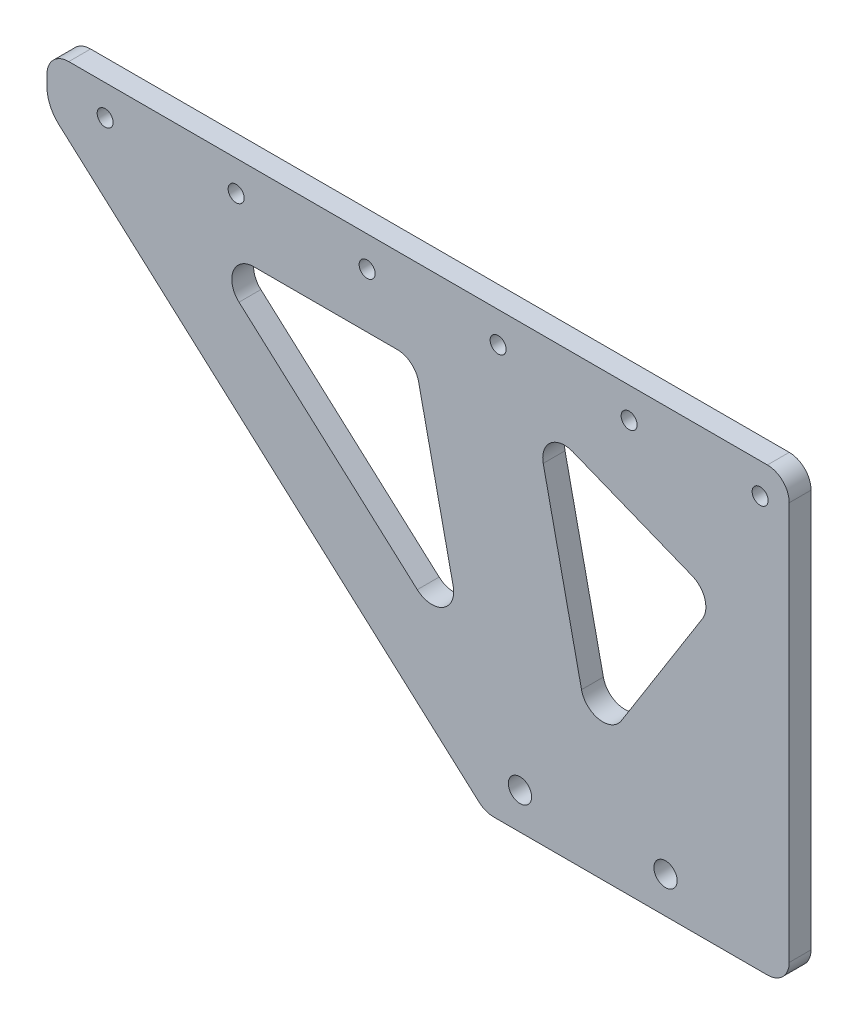
ISO-10303-21;
HEADER;
FILE_DESCRIPTION(('STEP AP214'),'2;1');
FILE_NAME('part.step','',(''),(''),'','','');
FILE_SCHEMA(('AUTOMOTIVE_DESIGN { 1 0 10303 214 1 1 1 1 }'));
ENDSEC;
DATA;
#1=APPLICATION_CONTEXT('core data for automotive mechanical design processes');
#2=APPLICATION_PROTOCOL_DEFINITION('international standard','automotive_design',2000,#1);
#3=PRODUCT_CONTEXT('',#1,'mechanical');
#4=PRODUCT('Part','Part','',(#3));
#5=PRODUCT_RELATED_PRODUCT_CATEGORY('part','',(#4));
#6=PRODUCT_DEFINITION_FORMATION('','',#4);
#7=PRODUCT_DEFINITION_CONTEXT('part definition',#1,'design');
#8=PRODUCT_DEFINITION('design','',#6,#7);
#9=PRODUCT_DEFINITION_SHAPE('','',#8);
#10=(LENGTH_UNIT() NAMED_UNIT(*) SI_UNIT(.MILLI.,.METRE.));
#11=(NAMED_UNIT(*) PLANE_ANGLE_UNIT() SI_UNIT($,.RADIAN.));
#12=(NAMED_UNIT(*) SI_UNIT($,.STERADIAN.) SOLID_ANGLE_UNIT());
#13=UNCERTAINTY_MEASURE_WITH_UNIT(LENGTH_MEASURE(1.E-05),#10,'distance_accuracy_value','');
#14=(GEOMETRIC_REPRESENTATION_CONTEXT(3) GLOBAL_UNCERTAINTY_ASSIGNED_CONTEXT((#13)) GLOBAL_UNIT_ASSIGNED_CONTEXT((#10,
#11,#12)) REPRESENTATION_CONTEXT('',''));
#15=CARTESIAN_POINT('',(0.,0.,0.));
#16=DIRECTION('',(0.,0.,1.));
#17=DIRECTION('',(1.,0.,0.));
#18=AXIS2_PLACEMENT_3D('',#15,#16,#17);
#19=CARTESIAN_POINT('',(-100.,-5.,3.));
#20=DIRECTION('',(1.,0.,0.));
#21=DIRECTION('',(0.,0.,-1.));
#22=AXIS2_PLACEMENT_3D('',#19,#20,#21);
#23=PLANE('',#22);
#24=DIRECTION('',(0.,-1.,0.));
#25=VECTOR('',#24,1.);
#26=CARTESIAN_POINT('',(-100.,-5.,3.));
#27=LINE('',#26,#25);
#28=CARTESIAN_POINT('',(-100.,-1.3,3.));
#29=VERTEX_POINT('',#28);
#30=CARTESIAN_POINT('',(-100.,-2.7674682433964,3.));
#31=VERTEX_POINT('',#30);
#32=EDGE_CURVE('E214',#29,#31,#27,.T.);
#33=ORIENTED_EDGE('',*,*,#32,.F.);
#34=DIRECTION('',(0.,0.,1.));
#35=VECTOR('',#34,1.);
#36=CARTESIAN_POINT('',(-100.,-1.3,0.));
#37=LINE('',#36,#35);
#38=CARTESIAN_POINT('',(-100.,-1.3,0.));
#39=VERTEX_POINT('',#38);
#40=EDGE_CURVE('E311',#29,#39,#37,.F.);
#41=ORIENTED_EDGE('',*,*,#40,.T.);
#42=DIRECTION('',(0.,-1.,0.));
#43=VECTOR('',#42,1.);
#44=CARTESIAN_POINT('',(-100.,-5.,0.));
#45=LINE('',#44,#43);
#46=CARTESIAN_POINT('',(-100.,-2.7674682433964,0.));
#47=VERTEX_POINT('',#46);
#48=EDGE_CURVE('E215',#39,#47,#45,.T.);
#49=ORIENTED_EDGE('',*,*,#48,.T.);
#50=DIRECTION('',(0.,0.,-1.));
#51=VECTOR('',#50,1.);
#52=CARTESIAN_POINT('',(-100.,-2.7674682433964,3.));
#53=LINE('',#52,#51);
#54=EDGE_CURVE('E198',#47,#31,#53,.F.);
#55=ORIENTED_EDGE('',*,*,#54,.T.);
#56=EDGE_LOOP('',(#33,#41,#49,#55));
#57=FACE_BOUND('',#56,.T.);
#58=ADVANCED_FACE('F41',(#57),#23,.F.);
#59=CARTESIAN_POINT('',(-42.,-57.,3.));
#60=DIRECTION('',(0.667545015752026,0.74456944064649,0.));
#61=DIRECTION('',(-0.74456944064649,0.667545015752026,0.));
#62=AXIS2_PLACEMENT_3D('',#59,#60,#61);
#63=PLANE('',#62);
#64=DIRECTION('',(0.74456944064649,-0.667545015752026,0.));
#65=VECTOR('',#64,1.);
#66=CARTESIAN_POINT('',(-42.,-57.,0.));
#67=LINE('',#66,#65);
#68=CARTESIAN_POINT('',(-98.3377250787601,-6.49031544662886,0.));
#69=VERTEX_POINT('',#68);
#70=CARTESIAN_POINT('',(-40.6239407178367,-58.2337083219395,0.));
#71=VERTEX_POINT('',#70);
#72=EDGE_CURVE('E206',#69,#71,#67,.T.);
#73=ORIENTED_EDGE('',*,*,#72,.T.);
#74=DIRECTION('',(0.,0.,1.));
#75=VECTOR('',#74,1.);
#76=CARTESIAN_POINT('',(-40.6239407178367,-58.2337083219395,3.));
#77=LINE('',#76,#75);
#78=CARTESIAN_POINT('',(-40.6239407178367,-58.2337083219395,3.));
#79=VERTEX_POINT('',#78);
#80=EDGE_CURVE('E11',#71,#79,#77,.T.);
#81=ORIENTED_EDGE('',*,*,#80,.T.);
#82=DIRECTION('',(0.74456944064649,-0.667545015752026,0.));
#83=VECTOR('',#82,1.);
#84=CARTESIAN_POINT('',(-42.,-57.,3.));
#85=LINE('',#84,#83);
#86=CARTESIAN_POINT('',(-98.3377250787601,-6.49031544662886,3.));
#87=VERTEX_POINT('',#86);
#88=EDGE_CURVE('E209',#87,#79,#85,.T.);
#89=ORIENTED_EDGE('',*,*,#88,.F.);
#90=DIRECTION('',(0.,0.,-1.));
#91=VECTOR('',#90,1.);
#92=CARTESIAN_POINT('',(-98.3377250787601,-6.49031544662884,3.));
#93=LINE('',#92,#91);
#94=EDGE_CURVE('E196',#87,#69,#93,.T.);
#95=ORIENTED_EDGE('',*,*,#94,.T.);
#96=EDGE_LOOP('',(#73,#81,#89,#95));
#97=FACE_BOUND('',#96,.T.);
#98=ADVANCED_FACE('F205',(#97),#63,.F.);
#99=CARTESIAN_POINT('',(0.,0.,3.));
#100=DIRECTION('',(0.,0.,-1.));
#101=DIRECTION('',(-1.,0.,0.));
#102=AXIS2_PLACEMENT_3D('',#99,#100,#101);
#103=PLANE('',#102);
#104=DIRECTION('',(0.74456944064649,-0.667545015752026,0.));
#105=VECTOR('',#104,1.);
#106=CARTESIAN_POINT('',(-79.4428137737304,-10.,3.));
#107=LINE('',#106,#105);
#108=CARTESIAN_POINT('',(-73.6052160300287,-15.2337083219395,3.));
#109=VERTEX_POINT('',#108);
#110=CARTESIAN_POINT('',(-49.1089723530373,-37.195857825449,3.));
#111=VERTEX_POINT('',#110);
#112=EDGE_CURVE('E359',#109,#111,#107,.T.);
#113=ORIENTED_EDGE('',*,*,#112,.F.);
#114=CARTESIAN_POINT('',(-71.6025809827726,-13.,3.));
#115=DIRECTION('',(0.,0.,-1.));
#116=DIRECTION('',(-1.,0.,0.));
#117=AXIS2_PLACEMENT_3D('',#114,#115,#116);
#118=CIRCLE('',#117,3.);
#119=CARTESIAN_POINT('',(-71.6025809827726,-10.,3.));
#120=VERTEX_POINT('',#119);
#121=EDGE_CURVE('E289',#109,#120,#118,.T.);
#122=ORIENTED_EDGE('',*,*,#121,.T.);
#123=DIRECTION('',(-1.,0.,0.));
#124=VECTOR('',#123,1.);
#125=CARTESIAN_POINT('',(-79.4428137737304,-10.,3.));
#126=LINE('',#125,#124);
#127=CARTESIAN_POINT('',(-51.8626542495009,-10.,3.));
#128=VERTEX_POINT('',#127);
#129=EDGE_CURVE('E356',#128,#120,#126,.T.);
#130=ORIENTED_EDGE('',*,*,#129,.F.);
#131=CARTESIAN_POINT('',(-51.8626542495009,-13.,3.));
#132=DIRECTION('',(0.,0.,-1.));
#133=DIRECTION('',(-1.,0.,0.));
#134=AXIS2_PLACEMENT_3D('',#131,#132,#133);
#135=CIRCLE('',#134,3.);
#136=CARTESIAN_POINT('',(-48.9306254739786,-12.3650139690442,3.));
#137=VERTEX_POINT('',#136);
#138=EDGE_CURVE('E281',#128,#137,#135,.T.);
#139=ORIENTED_EDGE('',*,*,#138,.T.);
#140=DIRECTION('',(-0.211662010318587,0.977342925174114,0.));
#141=VECTOR('',#140,1.);
#142=CARTESIAN_POINT('',(-49.4428137737304,-10.,3.));
#143=LINE('',#142,#141);
#144=CARTESIAN_POINT('',(-44.1743085302589,-34.3271634725538,3.));
#145=VERTEX_POINT('',#144);
#146=EDGE_CURVE('E363',#145,#137,#143,.T.);
#147=ORIENTED_EDGE('',*,*,#146,.F.);
#148=CARTESIAN_POINT('',(-47.1063373057812,-34.9621495035095,3.));
#149=DIRECTION('',(0.,0.,-1.));
#150=DIRECTION('',(-1.,0.,0.));
#151=AXIS2_PLACEMENT_3D('',#148,#149,#150);
#152=CIRCLE('',#151,3.);
#153=EDGE_CURVE('E285',#145,#111,#152,.T.);
#154=ORIENTED_EDGE('',*,*,#153,.T.);
#155=EDGE_LOOP('',(#113,#122,#130,#139,#147,#154));
#156=FACE_BOUND('',#155,.T.);
#157=DIRECTION('',(0.532520352814284,0.846417198453901,0.));
#158=VECTOR('',#157,1.);
#159=CARTESIAN_POINT('',(-7.99999999999999,-18.,3.));
#160=LINE('',#159,#158);
#161=CARTESIAN_POINT('',(-21.0718268380449,-38.7770820259917,3.));
#162=VERTEX_POINT('',#161);
#163=CARTESIAN_POINT('',(-9.91658473540623,-21.0463254104164,3.));
#164=VERTEX_POINT('',#163);
#165=EDGE_CURVE('E369',#162,#164,#160,.T.);
#166=ORIENTED_EDGE('',*,*,#165,.F.);
#167=CARTESIAN_POINT('',(-23.6110784334066,-37.1795209675489,3.));
#168=DIRECTION('',(0.,0.,-1.));
#169=DIRECTION('',(-1.,0.,0.));
#170=AXIS2_PLACEMENT_3D('',#167,#168,#169);
#171=CIRCLE('',#170,3.);
#172=CARTESIAN_POINT('',(-26.5431072089289,-37.8145069985046,3.));
#173=VERTEX_POINT('',#172);
#174=EDGE_CURVE('E277',#162,#173,#171,.T.);
#175=ORIENTED_EDGE('',*,*,#174,.T.);
#176=DIRECTION('',(0.211662010318587,-0.977342925174114,0.));
#177=VECTOR('',#176,1.);
#178=CARTESIAN_POINT('',(-24.9869534223184,-45.,3.));
#179=LINE('',#178,#177);
#180=CARTESIAN_POINT('',(-31.8052323429341,-13.5168034882718,3.));
#181=VERTEX_POINT('',#180);
#182=EDGE_CURVE('E360',#181,#173,#179,.T.);
#183=ORIENTED_EDGE('',*,*,#182,.F.);
#184=CARTESIAN_POINT('',(-28.8732035674118,-12.881817457316,3.));
#185=DIRECTION('',(0.,0.,-1.));
#186=DIRECTION('',(-1.,0.,0.));
#187=AXIS2_PLACEMENT_3D('',#184,#185,#186);
#188=CIRCLE('',#187,3.);
#189=CARTESIAN_POINT('',(-27.7590315383495,-10.0963873846602,3.));
#190=VERTEX_POINT('',#189);
#191=EDGE_CURVE('E293',#181,#190,#188,.T.);
#192=ORIENTED_EDGE('',*,*,#191,.T.);
#193=DIRECTION('',(-0.928476690885259,0.371390676354103,0.));
#194=VECTOR('',#193,1.);
#195=CARTESIAN_POINT('',(-33.,-8.,3.));
#196=LINE('',#195,#194);
#197=CARTESIAN_POINT('',(-11.3416643017056,-16.6633342793177,3.));
#198=VERTEX_POINT('',#197);
#199=EDGE_CURVE('E355',#198,#190,#196,.T.);
#200=ORIENTED_EDGE('',*,*,#199,.F.);
#201=CARTESIAN_POINT('',(-12.4558363307679,-19.4487643519735,3.));
#202=DIRECTION('',(0.,0.,-1.));
#203=DIRECTION('',(-1.,0.,0.));
#204=AXIS2_PLACEMENT_3D('',#201,#202,#203);
#205=CIRCLE('',#204,3.);
#206=EDGE_CURVE('E273',#198,#164,#205,.T.);
#207=ORIENTED_EDGE('',*,*,#206,.T.);
#208=EDGE_LOOP('',(#166,#175,#183,#192,#200,#207));
#209=FACE_BOUND('',#208,.T.);
#210=CARTESIAN_POINT('',(-15.,-54.,3.));
#211=DIRECTION('',(0.,0.,1.));
#212=DIRECTION('',(1.,0.,0.));
#213=AXIS2_PLACEMENT_3D('',#210,#211,#212);
#214=CIRCLE('',#213,1.6);
#215=CARTESIAN_POINT('',(-13.4,-54.,3.));
#216=VERTEX_POINT('',#215);
#217=EDGE_CURVE('E377',#216,#216,#214,.T.);
#218=ORIENTED_EDGE('',*,*,#217,.F.);
#219=EDGE_LOOP('',(#218));
#220=FACE_BOUND('',#219,.T.);
#221=CARTESIAN_POINT('',(-74.0000000000001,-2.50000000000026,3.));
#222=DIRECTION('',(0.,0.,1.));
#223=DIRECTION('',(-1.,0.,0.));
#224=AXIS2_PLACEMENT_3D('',#221,#222,#223);
#225=CIRCLE('',#224,1.09999999999999);
#226=CARTESIAN_POINT('',(-75.1000000000001,-2.50000000000026,3.));
#227=VERTEX_POINT('',#226);
#228=EDGE_CURVE('E408',#227,#227,#225,.T.);
#229=ORIENTED_EDGE('',*,*,#228,.F.);
#230=EDGE_LOOP('',(#229));
#231=FACE_BOUND('',#230,.T.);
#232=CARTESIAN_POINT('',(-20.,-2.5,3.));
#233=DIRECTION('',(0.,0.,1.));
#234=DIRECTION('',(1.,0.,0.));
#235=AXIS2_PLACEMENT_3D('',#232,#233,#234);
#236=CIRCLE('',#235,1.1);
#237=CARTESIAN_POINT('',(-18.9,-2.5,3.));
#238=VERTEX_POINT('',#237);
#239=EDGE_CURVE('E401',#238,#238,#236,.T.);
#240=ORIENTED_EDGE('',*,*,#239,.F.);
#241=EDGE_LOOP('',(#240));
#242=FACE_BOUND('',#241,.T.);
#243=CARTESIAN_POINT('',(-1.99999999999989,-2.5,3.));
#244=DIRECTION('',(0.,0.,1.));
#245=DIRECTION('',(1.,0.,0.));
#246=AXIS2_PLACEMENT_3D('',#243,#244,#245);
#247=CIRCLE('',#246,1.1);
#248=CARTESIAN_POINT('',(-0.899999999999891,-2.5,3.));
#249=VERTEX_POINT('',#248);
#250=EDGE_CURVE('E395',#249,#249,#247,.T.);
#251=ORIENTED_EDGE('',*,*,#250,.F.);
#252=EDGE_LOOP('',(#251));
#253=FACE_BOUND('',#252,.T.);
#254=CARTESIAN_POINT('',(-92.0000000000001,-2.50000000000038,3.));
#255=DIRECTION('',(0.,0.,1.));
#256=DIRECTION('',(-1.,0.,0.));
#257=AXIS2_PLACEMENT_3D('',#254,#255,#256);
#258=CIRCLE('',#257,1.10000000000001);
#259=CARTESIAN_POINT('',(-93.1000000000001,-2.50000000000038,3.));
#260=VERTEX_POINT('',#259);
#261=EDGE_CURVE('E366',#260,#260,#258,.T.);
#262=ORIENTED_EDGE('',*,*,#261,.F.);
#263=EDGE_LOOP('',(#262));
#264=FACE_BOUND('',#263,.T.);
#265=CARTESIAN_POINT('',(-35.,-54.,3.));
#266=DIRECTION('',(0.,0.,1.));
#267=DIRECTION('',(1.,0.,0.));
#268=AXIS2_PLACEMENT_3D('',#265,#266,#267);
#269=CIRCLE('',#268,1.6);
#270=CARTESIAN_POINT('',(-33.4,-54.,3.));
#271=VERTEX_POINT('',#270);
#272=EDGE_CURVE('E384',#271,#271,#269,.T.);
#273=ORIENTED_EDGE('',*,*,#272,.F.);
#274=EDGE_LOOP('',(#273));
#275=FACE_BOUND('',#274,.T.);
#276=CARTESIAN_POINT('',(-38.0000000000001,-2.50000000000001,3.));
#277=DIRECTION('',(0.,0.,1.));
#278=DIRECTION('',(-1.,0.,0.));
#279=AXIS2_PLACEMENT_3D('',#276,#277,#278);
#280=CIRCLE('',#279,1.10000000000001);
#281=CARTESIAN_POINT('',(-39.1000000000001,-2.50000000000001,3.));
#282=VERTEX_POINT('',#281);
#283=EDGE_CURVE('E378',#282,#282,#280,.T.);
#284=ORIENTED_EDGE('',*,*,#283,.F.);
#285=EDGE_LOOP('',(#284));
#286=FACE_BOUND('',#285,.T.);
#287=CARTESIAN_POINT('',(-56.0000000000001,-2.50000000000013,3.));
#288=DIRECTION('',(0.,0.,1.));
#289=DIRECTION('',(-1.,0.,0.));
#290=AXIS2_PLACEMENT_3D('',#287,#288,#289);
#291=CIRCLE('',#290,1.10000000000001);
#292=CARTESIAN_POINT('',(-57.1000000000001,-2.50000000000013,3.));
#293=VERTEX_POINT('',#292);
#294=EDGE_CURVE('E407',#293,#293,#291,.T.);
#295=ORIENTED_EDGE('',*,*,#294,.F.);
#296=EDGE_LOOP('',(#295));
#297=FACE_BOUND('',#296,.T.);
#298=DIRECTION('',(1.,0.,0.));
#299=VECTOR('',#298,1.);
#300=CARTESIAN_POINT('',(-100.,1.7,3.));
#301=LINE('',#300,#299);
#302=CARTESIAN_POINT('',(-97.,1.7,3.));
#303=VERTEX_POINT('',#302);
#304=CARTESIAN_POINT('',(-1.,1.7,3.));
#305=VERTEX_POINT('',#304);
#306=EDGE_CURVE('E346',#303,#305,#301,.T.);
#307=ORIENTED_EDGE('',*,*,#306,.F.);
#308=CARTESIAN_POINT('',(-97.,-1.3,3.));
#309=DIRECTION('',(0.,0.,-1.));
#310=DIRECTION('',(-1.,0.,0.));
#311=AXIS2_PLACEMENT_3D('',#308,#309,#310);
#312=CIRCLE('',#311,3.);
#313=EDGE_CURVE('E309',#303,#29,#312,.F.);
#314=ORIENTED_EDGE('',*,*,#313,.T.);
#315=ORIENTED_EDGE('',*,*,#32,.T.);
#316=CARTESIAN_POINT('',(-95.,-2.7674682433964,3.));
#317=DIRECTION('',(0.,0.,-1.));
#318=DIRECTION('',(-1.,0.,0.));
#319=AXIS2_PLACEMENT_3D('',#316,#317,#318);
#320=CIRCLE('',#319,5.);
#321=EDGE_CURVE('E223',#31,#87,#320,.F.);
#322=ORIENTED_EDGE('',*,*,#321,.T.);
#323=ORIENTED_EDGE('',*,*,#88,.T.);
#324=CARTESIAN_POINT('',(-38.6213056705807,-56.,3.));
#325=DIRECTION('',(0.,0.,-1.));
#326=DIRECTION('',(-1.,0.,0.));
#327=AXIS2_PLACEMENT_3D('',#324,#325,#326);
#328=CIRCLE('',#327,3.);
#329=CARTESIAN_POINT('',(-38.6213056705807,-59.,3.));
#330=VERTEX_POINT('',#329);
#331=EDGE_CURVE('E305',#79,#330,#328,.F.);
#332=ORIENTED_EDGE('',*,*,#331,.T.);
#333=DIRECTION('',(1.,0.,0.));
#334=VECTOR('',#333,1.);
#335=CARTESIAN_POINT('',(0.,-59.,3.));
#336=LINE('',#335,#334);
#337=CARTESIAN_POINT('',(-0.999999999999992,-59.,3.));
#338=VERTEX_POINT('',#337);
#339=EDGE_CURVE('E327',#330,#338,#336,.T.);
#340=ORIENTED_EDGE('',*,*,#339,.T.);
#341=CARTESIAN_POINT('',(-0.999999999999993,-56.,3.));
#342=DIRECTION('',(0.,0.,-1.));
#343=DIRECTION('',(-1.,0.,0.));
#344=AXIS2_PLACEMENT_3D('',#341,#342,#343);
#345=CIRCLE('',#344,3.);
#346=CARTESIAN_POINT('',(2.00000000000001,-56.,3.));
#347=VERTEX_POINT('',#346);
#348=EDGE_CURVE('E307',#338,#347,#345,.F.);
#349=ORIENTED_EDGE('',*,*,#348,.T.);
#350=DIRECTION('',(0.,-1.,0.));
#351=VECTOR('',#350,1.);
#352=CARTESIAN_POINT('',(2.,0.,3.));
#353=LINE('',#352,#351);
#354=CARTESIAN_POINT('',(2.,-1.3,3.));
#355=VERTEX_POINT('',#354);
#356=EDGE_CURVE('E336',#355,#347,#353,.T.);
#357=ORIENTED_EDGE('',*,*,#356,.F.);
#358=CARTESIAN_POINT('',(-1.,-1.3,3.));
#359=DIRECTION('',(0.,0.,-1.));
#360=DIRECTION('',(-1.,0.,0.));
#361=AXIS2_PLACEMENT_3D('',#358,#359,#360);
#362=CIRCLE('',#361,3.);
#363=EDGE_CURVE('E303',#355,#305,#362,.F.);
#364=ORIENTED_EDGE('',*,*,#363,.T.);
#365=EDGE_LOOP('',(#307,#314,#315,#322,#323,#332,#340,#349,#357,#364));
#366=FACE_BOUND('',#365,.T.);
#367=ADVANCED_FACE('F333',(#156,#209,#220,#231,#242,#253,#264,#275,#286,#297,#366),#103,.F.);
#368=CARTESIAN_POINT('',(0.,0.,0.));
#369=DIRECTION('',(0.,0.,-1.));
#370=DIRECTION('',(-1.,0.,0.));
#371=AXIS2_PLACEMENT_3D('',#368,#369,#370);
#372=PLANE('',#371);
#373=DIRECTION('',(1.,0.,0.));
#374=VECTOR('',#373,1.);
#375=CARTESIAN_POINT('',(0.,-9.99999999999999,0.));
#376=LINE('',#375,#374);
#377=CARTESIAN_POINT('',(-71.6025809827726,-10.,0.));
#378=VERTEX_POINT('',#377);
#379=CARTESIAN_POINT('',(-51.8626542495009,-10.,0.));
#380=VERTEX_POINT('',#379);
#381=EDGE_CURVE('E240',#378,#380,#376,.T.);
#382=ORIENTED_EDGE('',*,*,#381,.F.);
#383=CARTESIAN_POINT('',(-71.6025809827726,-13.,0.));
#384=DIRECTION('',(0.,0.,-1.));
#385=DIRECTION('',(-1.,0.,0.));
#386=AXIS2_PLACEMENT_3D('',#383,#384,#385);
#387=CIRCLE('',#386,3.);
#388=CARTESIAN_POINT('',(-73.6052160300287,-15.2337083219395,0.));
#389=VERTEX_POINT('',#388);
#390=EDGE_CURVE('E291',#378,#389,#387,.F.);
#391=ORIENTED_EDGE('',*,*,#390,.T.);
#392=DIRECTION('',(-0.74456944064649,0.667545015752026,0.));
#393=VECTOR('',#392,1.);
#394=CARTESIAN_POINT('',(-40.3713527429412,-45.0295857517421,0.));
#395=LINE('',#394,#393);
#396=CARTESIAN_POINT('',(-49.1089723530373,-37.195857825449,0.));
#397=VERTEX_POINT('',#396);
#398=EDGE_CURVE('E234',#397,#389,#395,.T.);
#399=ORIENTED_EDGE('',*,*,#398,.F.);
#400=CARTESIAN_POINT('',(-47.1063373057812,-34.9621495035095,0.));
#401=DIRECTION('',(0.,0.,-1.));
#402=DIRECTION('',(-1.,0.,0.));
#403=AXIS2_PLACEMENT_3D('',#400,#401,#402);
#404=CIRCLE('',#403,3.);
#405=CARTESIAN_POINT('',(-44.1743085302589,-34.3271634725538,0.));
#406=VERTEX_POINT('',#405);
#407=EDGE_CURVE('E287',#397,#406,#404,.F.);
#408=ORIENTED_EDGE('',*,*,#407,.T.);
#409=DIRECTION('',(0.211662010318587,-0.977342925174114,0.));
#410=VECTOR('',#409,1.);
#411=CARTESIAN_POINT('',(-49.2963995186252,-10.6760633906687,0.));
#412=LINE('',#411,#410);
#413=CARTESIAN_POINT('',(-48.9306254739786,-12.3650139690442,0.));
#414=VERTEX_POINT('',#413);
#415=EDGE_CURVE('E237',#414,#406,#412,.T.);
#416=ORIENTED_EDGE('',*,*,#415,.F.);
#417=CARTESIAN_POINT('',(-51.8626542495009,-13.,0.));
#418=DIRECTION('',(0.,0.,-1.));
#419=DIRECTION('',(-1.,0.,0.));
#420=AXIS2_PLACEMENT_3D('',#417,#418,#419);
#421=CIRCLE('',#420,3.);
#422=EDGE_CURVE('E283',#414,#380,#421,.F.);
#423=ORIENTED_EDGE('',*,*,#422,.T.);
#424=EDGE_LOOP('',(#382,#391,#399,#408,#416,#423));
#425=FACE_BOUND('',#424,.T.);
#426=DIRECTION('',(-0.211662010318587,0.977342925174114,0.));
#427=VECTOR('',#426,1.);
#428=CARTESIAN_POINT('',(-33.1765043283045,-7.18499660722589,0.));
#429=LINE('',#428,#427);
#430=CARTESIAN_POINT('',(-26.5431072089289,-37.8145069985046,0.));
#431=VERTEX_POINT('',#430);
#432=CARTESIAN_POINT('',(-31.8052323429341,-13.5168034882718,0.));
#433=VERTEX_POINT('',#432);
#434=EDGE_CURVE('E231',#431,#433,#429,.T.);
#435=ORIENTED_EDGE('',*,*,#434,.F.);
#436=CARTESIAN_POINT('',(-23.6110784334066,-37.1795209675489,0.));
#437=DIRECTION('',(0.,0.,-1.));
#438=DIRECTION('',(-1.,0.,0.));
#439=AXIS2_PLACEMENT_3D('',#436,#437,#438);
#440=CIRCLE('',#439,3.);
#441=CARTESIAN_POINT('',(-21.0718268380449,-38.7770820259917,0.));
#442=VERTEX_POINT('',#441);
#443=EDGE_CURVE('E279',#431,#442,#440,.F.);
#444=ORIENTED_EDGE('',*,*,#443,.T.);
#445=DIRECTION('',(-0.532520352814284,-0.846417198453901,0.));
#446=VECTOR('',#445,1.);
#447=CARTESIAN_POINT('',(2.38184234196909,-1.49852758971611,0.));
#448=LINE('',#447,#446);
#449=CARTESIAN_POINT('',(-9.91658473540623,-21.0463254104164,0.));
#450=VERTEX_POINT('',#449);
#451=EDGE_CURVE('E225',#450,#442,#448,.T.);
#452=ORIENTED_EDGE('',*,*,#451,.F.);
#453=CARTESIAN_POINT('',(-12.4558363307679,-19.4487643519735,0.));
#454=DIRECTION('',(0.,0.,-1.));
#455=DIRECTION('',(-1.,0.,0.));
#456=AXIS2_PLACEMENT_3D('',#453,#454,#455);
#457=CIRCLE('',#456,3.);
#458=CARTESIAN_POINT('',(-11.3416643017056,-16.6633342793177,0.));
#459=VERTEX_POINT('',#458);
#460=EDGE_CURVE('E275',#450,#459,#457,.F.);
#461=ORIENTED_EDGE('',*,*,#460,.T.);
#462=DIRECTION('',(0.928476690885259,-0.371390676354103,0.));
#463=VECTOR('',#462,1.);
#464=CARTESIAN_POINT('',(-7.3103448275862,-18.2758620689655,0.));
#465=LINE('',#464,#463);
#466=CARTESIAN_POINT('',(-27.7590315383495,-10.0963873846602,0.));
#467=VERTEX_POINT('',#466);
#468=EDGE_CURVE('E228',#467,#459,#465,.T.);
#469=ORIENTED_EDGE('',*,*,#468,.F.);
#470=CARTESIAN_POINT('',(-28.8732035674118,-12.881817457316,0.));
#471=DIRECTION('',(0.,0.,-1.));
#472=DIRECTION('',(-1.,0.,0.));
#473=AXIS2_PLACEMENT_3D('',#470,#471,#472);
#474=CIRCLE('',#473,3.);
#475=EDGE_CURVE('E295',#467,#433,#474,.F.);
#476=ORIENTED_EDGE('',*,*,#475,.T.);
#477=EDGE_LOOP('',(#435,#444,#452,#461,#469,#476));
#478=FACE_BOUND('',#477,.T.);
#479=CARTESIAN_POINT('',(-15.,-54.,0.));
#480=DIRECTION('',(0.,0.,1.));
#481=DIRECTION('',(1.,0.,0.));
#482=AXIS2_PLACEMENT_3D('',#479,#480,#481);
#483=CIRCLE('',#482,1.6);
#484=CARTESIAN_POINT('',(-13.4,-54.,0.));
#485=VERTEX_POINT('',#484);
#486=EDGE_CURVE('E392',#485,#485,#483,.T.);
#487=ORIENTED_EDGE('',*,*,#486,.T.);
#488=EDGE_LOOP('',(#487));
#489=FACE_BOUND('',#488,.T.);
#490=CARTESIAN_POINT('',(-74.0000000000001,-2.50000000000026,0.));
#491=DIRECTION('',(0.,0.,1.));
#492=DIRECTION('',(-1.,0.,0.));
#493=AXIS2_PLACEMENT_3D('',#490,#491,#492);
#494=CIRCLE('',#493,1.09999999999999);
#495=CARTESIAN_POINT('',(-75.1000000000001,-2.50000000000026,0.));
#496=VERTEX_POINT('',#495);
#497=EDGE_CURVE('E404',#496,#496,#494,.T.);
#498=ORIENTED_EDGE('',*,*,#497,.T.);
#499=EDGE_LOOP('',(#498));
#500=FACE_BOUND('',#499,.T.);
#501=CARTESIAN_POINT('',(-20.,-2.5,0.));
#502=DIRECTION('',(0.,0.,1.));
#503=DIRECTION('',(1.,0.,0.));
#504=AXIS2_PLACEMENT_3D('',#501,#502,#503);
#505=CIRCLE('',#504,1.1);
#506=CARTESIAN_POINT('',(-18.9,-2.5,0.));
#507=VERTEX_POINT('',#506);
#508=EDGE_CURVE('E411',#507,#507,#505,.T.);
#509=ORIENTED_EDGE('',*,*,#508,.T.);
#510=EDGE_LOOP('',(#509));
#511=FACE_BOUND('',#510,.T.);
#512=CARTESIAN_POINT('',(-1.99999999999989,-2.5,0.));
#513=DIRECTION('',(0.,0.,1.));
#514=DIRECTION('',(1.,0.,0.));
#515=AXIS2_PLACEMENT_3D('',#512,#513,#514);
#516=CIRCLE('',#515,1.1);
#517=CARTESIAN_POINT('',(-0.899999999999891,-2.5,0.));
#518=VERTEX_POINT('',#517);
#519=EDGE_CURVE('E398',#518,#518,#516,.T.);
#520=ORIENTED_EDGE('',*,*,#519,.T.);
#521=EDGE_LOOP('',(#520));
#522=FACE_BOUND('',#521,.T.);
#523=CARTESIAN_POINT('',(-92.0000000000001,-2.50000000000038,0.));
#524=DIRECTION('',(0.,0.,1.));
#525=DIRECTION('',(-1.,0.,0.));
#526=AXIS2_PLACEMENT_3D('',#523,#524,#525);
#527=CIRCLE('',#526,1.10000000000001);
#528=CARTESIAN_POINT('',(-93.1000000000001,-2.50000000000038,0.));
#529=VERTEX_POINT('',#528);
#530=EDGE_CURVE('E387',#529,#529,#527,.T.);
#531=ORIENTED_EDGE('',*,*,#530,.T.);
#532=EDGE_LOOP('',(#531));
#533=FACE_BOUND('',#532,.T.);
#534=CARTESIAN_POINT('',(-35.,-54.,0.));
#535=DIRECTION('',(0.,0.,1.));
#536=DIRECTION('',(1.,0.,0.));
#537=AXIS2_PLACEMENT_3D('',#534,#535,#536);
#538=CIRCLE('',#537,1.6);
#539=CARTESIAN_POINT('',(-33.4,-54.,0.));
#540=VERTEX_POINT('',#539);
#541=EDGE_CURVE('E381',#540,#540,#538,.T.);
#542=ORIENTED_EDGE('',*,*,#541,.T.);
#543=EDGE_LOOP('',(#542));
#544=FACE_BOUND('',#543,.T.);
#545=CARTESIAN_POINT('',(-38.0000000000001,-2.50000000000001,0.));
#546=DIRECTION('',(0.,0.,1.));
#547=DIRECTION('',(-1.,0.,0.));
#548=AXIS2_PLACEMENT_3D('',#545,#546,#547);
#549=CIRCLE('',#548,1.10000000000001);
#550=CARTESIAN_POINT('',(-39.1000000000001,-2.50000000000001,0.));
#551=VERTEX_POINT('',#550);
#552=EDGE_CURVE('E374',#551,#551,#549,.T.);
#553=ORIENTED_EDGE('',*,*,#552,.T.);
#554=EDGE_LOOP('',(#553));
#555=FACE_BOUND('',#554,.T.);
#556=CARTESIAN_POINT('',(-56.0000000000001,-2.50000000000013,0.));
#557=DIRECTION('',(0.,0.,1.));
#558=DIRECTION('',(-1.,0.,0.));
#559=AXIS2_PLACEMENT_3D('',#556,#557,#558);
#560=CIRCLE('',#559,1.10000000000001);
#561=CARTESIAN_POINT('',(-57.1000000000001,-2.50000000000013,0.));
#562=VERTEX_POINT('',#561);
#563=EDGE_CURVE('E218',#562,#562,#560,.T.);
#564=ORIENTED_EDGE('',*,*,#563,.T.);
#565=EDGE_LOOP('',(#564));
#566=FACE_BOUND('',#565,.T.);
#567=ORIENTED_EDGE('',*,*,#48,.F.);
#568=CARTESIAN_POINT('',(-97.,-1.3,0.));
#569=DIRECTION('',(0.,0.,-1.));
#570=DIRECTION('',(-1.,0.,0.));
#571=AXIS2_PLACEMENT_3D('',#568,#569,#570);
#572=CIRCLE('',#571,3.);
#573=CARTESIAN_POINT('',(-97.,1.7,0.));
#574=VERTEX_POINT('',#573);
#575=EDGE_CURVE('E317',#39,#574,#572,.T.);
#576=ORIENTED_EDGE('',*,*,#575,.T.);
#577=DIRECTION('',(-1.,0.,0.));
#578=VECTOR('',#577,1.);
#579=CARTESIAN_POINT('',(2.,1.7,0.));
#580=LINE('',#579,#578);
#581=CARTESIAN_POINT('',(-1.,1.7,0.));
#582=VERTEX_POINT('',#581);
#583=EDGE_CURVE('E350',#582,#574,#580,.T.);
#584=ORIENTED_EDGE('',*,*,#583,.F.);
#585=CARTESIAN_POINT('',(-1.,-1.3,0.));
#586=DIRECTION('',(0.,0.,-1.));
#587=DIRECTION('',(-1.,0.,0.));
#588=AXIS2_PLACEMENT_3D('',#585,#586,#587);
#589=CIRCLE('',#588,3.);
#590=CARTESIAN_POINT('',(2.,-1.3,0.));
#591=VERTEX_POINT('',#590);
#592=EDGE_CURVE('E313',#582,#591,#589,.T.);
#593=ORIENTED_EDGE('',*,*,#592,.T.);
#594=DIRECTION('',(0.,1.,0.));
#595=VECTOR('',#594,1.);
#596=CARTESIAN_POINT('',(2.00000000000001,-59.,0.));
#597=LINE('',#596,#595);
#598=CARTESIAN_POINT('',(2.00000000000001,-56.,0.));
#599=VERTEX_POINT('',#598);
#600=EDGE_CURVE('E343',#599,#591,#597,.T.);
#601=ORIENTED_EDGE('',*,*,#600,.F.);
#602=CARTESIAN_POINT('',(-0.999999999999993,-56.,0.));
#603=DIRECTION('',(0.,0.,-1.));
#604=DIRECTION('',(-1.,0.,0.));
#605=AXIS2_PLACEMENT_3D('',#602,#603,#604);
#606=CIRCLE('',#605,3.);
#607=CARTESIAN_POINT('',(-0.999999999999992,-59.,0.));
#608=VERTEX_POINT('',#607);
#609=EDGE_CURVE('E56',#599,#608,#606,.T.);
#610=ORIENTED_EDGE('',*,*,#609,.T.);
#611=DIRECTION('',(1.,0.,0.));
#612=VECTOR('',#611,1.);
#613=CARTESIAN_POINT('',(0.,-59.,0.));
#614=LINE('',#613,#612);
#615=CARTESIAN_POINT('',(-38.6213056705807,-59.,0.));
#616=VERTEX_POINT('',#615);
#617=EDGE_CURVE('E328',#616,#608,#614,.T.);
#618=ORIENTED_EDGE('',*,*,#617,.F.);
#619=CARTESIAN_POINT('',(-38.6213056705807,-56.,0.));
#620=DIRECTION('',(0.,0.,-1.));
#621=DIRECTION('',(-1.,0.,0.));
#622=AXIS2_PLACEMENT_3D('',#619,#620,#621);
#623=CIRCLE('',#622,3.);
#624=EDGE_CURVE('E213',#616,#71,#623,.T.);
#625=ORIENTED_EDGE('',*,*,#624,.T.);
#626=ORIENTED_EDGE('',*,*,#72,.F.);
#627=CARTESIAN_POINT('',(-95.,-2.7674682433964,0.));
#628=DIRECTION('',(0.,0.,-1.));
#629=DIRECTION('',(-1.,0.,0.));
#630=AXIS2_PLACEMENT_3D('',#627,#628,#629);
#631=CIRCLE('',#630,5.);
#632=EDGE_CURVE('E192',#69,#47,#631,.T.);
#633=ORIENTED_EDGE('',*,*,#632,.T.);
#634=EDGE_LOOP('',(#567,#576,#584,#593,#601,#610,#618,#625,#626,#633));
#635=FACE_BOUND('',#634,.T.);
#636=ADVANCED_FACE('F211',(#425,#478,#489,#500,#511,#522,#533,#544,#555,#566,#635),#372,.T.);
#637=CARTESIAN_POINT('',(-56.0000000000001,-2.50000000000013,0.));
#638=DIRECTION('',(0.,0.,1.));
#639=DIRECTION('',(1.,0.,0.));
#640=AXIS2_PLACEMENT_3D('',#637,#638,#639);
#641=CYLINDRICAL_SURFACE('',#640,1.10000000000001);
#642=ORIENTED_EDGE('',*,*,#563,.F.);
#643=EDGE_LOOP('',(#642));
#644=FACE_BOUND('',#643,.T.);
#645=ORIENTED_EDGE('',*,*,#294,.T.);
#646=EDGE_LOOP('',(#645));
#647=FACE_BOUND('',#646,.T.);
#648=ADVANCED_FACE('F674',(#644,#647),#641,.F.);
#649=CARTESIAN_POINT('',(-38.0000000000001,-2.50000000000001,0.));
#650=DIRECTION('',(0.,0.,1.));
#651=DIRECTION('',(1.,0.,0.));
#652=AXIS2_PLACEMENT_3D('',#649,#650,#651);
#653=CYLINDRICAL_SURFACE('',#652,1.10000000000001);
#654=ORIENTED_EDGE('',*,*,#552,.F.);
#655=EDGE_LOOP('',(#654));
#656=FACE_BOUND('',#655,.T.);
#657=ORIENTED_EDGE('',*,*,#283,.T.);
#658=EDGE_LOOP('',(#657));
#659=FACE_BOUND('',#658,.T.);
#660=ADVANCED_FACE('F665',(#656,#659),#653,.F.);
#661=CARTESIAN_POINT('',(-35.,-54.,0.));
#662=DIRECTION('',(0.,0.,1.));
#663=DIRECTION('',(1.,0.,0.));
#664=AXIS2_PLACEMENT_3D('',#661,#662,#663);
#665=CYLINDRICAL_SURFACE('',#664,1.6);
#666=ORIENTED_EDGE('',*,*,#541,.F.);
#667=EDGE_LOOP('',(#666));
#668=FACE_BOUND('',#667,.T.);
#669=ORIENTED_EDGE('',*,*,#272,.T.);
#670=EDGE_LOOP('',(#669));
#671=FACE_BOUND('',#670,.T.);
#672=ADVANCED_FACE('F656',(#668,#671),#665,.F.);
#673=CARTESIAN_POINT('',(-92.0000000000001,-2.50000000000038,0.));
#674=DIRECTION('',(0.,0.,1.));
#675=DIRECTION('',(1.,0.,0.));
#676=AXIS2_PLACEMENT_3D('',#673,#674,#675);
#677=CYLINDRICAL_SURFACE('',#676,1.10000000000001);
#678=ORIENTED_EDGE('',*,*,#530,.F.);
#679=EDGE_LOOP('',(#678));
#680=FACE_BOUND('',#679,.T.);
#681=ORIENTED_EDGE('',*,*,#261,.T.);
#682=EDGE_LOOP('',(#681));
#683=FACE_BOUND('',#682,.T.);
#684=ADVANCED_FACE('F647',(#680,#683),#677,.F.);
#685=CARTESIAN_POINT('',(-1.99999999999989,-2.5,0.));
#686=DIRECTION('',(0.,0.,1.));
#687=DIRECTION('',(1.,0.,0.));
#688=AXIS2_PLACEMENT_3D('',#685,#686,#687);
#689=CYLINDRICAL_SURFACE('',#688,1.1);
#690=ORIENTED_EDGE('',*,*,#519,.F.);
#691=EDGE_LOOP('',(#690));
#692=FACE_BOUND('',#691,.T.);
#693=ORIENTED_EDGE('',*,*,#250,.T.);
#694=EDGE_LOOP('',(#693));
#695=FACE_BOUND('',#694,.T.);
#696=ADVANCED_FACE('F638',(#692,#695),#689,.F.);
#697=CARTESIAN_POINT('',(-20.,-2.5,0.));
#698=DIRECTION('',(0.,0.,1.));
#699=DIRECTION('',(1.,0.,0.));
#700=AXIS2_PLACEMENT_3D('',#697,#698,#699);
#701=CYLINDRICAL_SURFACE('',#700,1.1);
#702=ORIENTED_EDGE('',*,*,#508,.F.);
#703=EDGE_LOOP('',(#702));
#704=FACE_BOUND('',#703,.T.);
#705=ORIENTED_EDGE('',*,*,#239,.T.);
#706=EDGE_LOOP('',(#705));
#707=FACE_BOUND('',#706,.T.);
#708=ADVANCED_FACE('F629',(#704,#707),#701,.F.);
#709=CARTESIAN_POINT('',(-74.0000000000001,-2.50000000000026,0.));
#710=DIRECTION('',(0.,0.,1.));
#711=DIRECTION('',(1.,0.,0.));
#712=AXIS2_PLACEMENT_3D('',#709,#710,#711);
#713=CYLINDRICAL_SURFACE('',#712,1.09999999999999);
#714=ORIENTED_EDGE('',*,*,#497,.F.);
#715=EDGE_LOOP('',(#714));
#716=FACE_BOUND('',#715,.T.);
#717=ORIENTED_EDGE('',*,*,#228,.T.);
#718=EDGE_LOOP('',(#717));
#719=FACE_BOUND('',#718,.T.);
#720=ADVANCED_FACE('F620',(#716,#719),#713,.F.);
#721=CARTESIAN_POINT('',(-15.,-54.,0.));
#722=DIRECTION('',(0.,0.,1.));
#723=DIRECTION('',(1.,0.,0.));
#724=AXIS2_PLACEMENT_3D('',#721,#722,#723);
#725=CYLINDRICAL_SURFACE('',#724,1.6);
#726=ORIENTED_EDGE('',*,*,#486,.F.);
#727=EDGE_LOOP('',(#726));
#728=FACE_BOUND('',#727,.T.);
#729=ORIENTED_EDGE('',*,*,#217,.T.);
#730=EDGE_LOOP('',(#729));
#731=FACE_BOUND('',#730,.T.);
#732=ADVANCED_FACE('F450',(#728,#731),#725,.F.);
#733=CARTESIAN_POINT('',(-95.,-2.7674682433964,3.));
#734=DIRECTION('',(0.,0.,-1.));
#735=DIRECTION('',(-1.,0.,0.));
#736=AXIS2_PLACEMENT_3D('',#733,#734,#735);
#737=CYLINDRICAL_SURFACE('',#736,5.);
#738=ORIENTED_EDGE('',*,*,#321,.F.);
#739=ORIENTED_EDGE('',*,*,#54,.F.);
#740=ORIENTED_EDGE('',*,*,#632,.F.);
#741=ORIENTED_EDGE('',*,*,#94,.F.);
#742=EDGE_LOOP('',(#738,#739,#740,#741));
#743=FACE_BOUND('',#742,.T.);
#744=ADVANCED_FACE('F195',(#743),#737,.T.);
#745=CARTESIAN_POINT('',(-24.9869534223184,-45.,-7.));
#746=DIRECTION('',(-0.977342925174114,-0.211662010318587,0.));
#747=DIRECTION('',(0.211662010318587,-0.977342925174114,0.));
#748=AXIS2_PLACEMENT_3D('',#745,#746,#747);
#749=PLANE('',#748);
#750=ORIENTED_EDGE('',*,*,#182,.T.);
#751=DIRECTION('',(0.,0.,1.));
#752=VECTOR('',#751,1.);
#753=CARTESIAN_POINT('',(-26.5431072089289,-37.8145069985046,0.));
#754=LINE('',#753,#752);
#755=EDGE_CURVE('E256',#173,#431,#754,.F.);
#756=ORIENTED_EDGE('',*,*,#755,.T.);
#757=ORIENTED_EDGE('',*,*,#434,.T.);
#758=DIRECTION('',(0.,0.,1.));
#759=VECTOR('',#758,1.);
#760=CARTESIAN_POINT('',(-31.8052323429341,-13.5168034882718,3.));
#761=LINE('',#760,#759);
#762=EDGE_CURVE('E253',#433,#181,#761,.T.);
#763=ORIENTED_EDGE('',*,*,#762,.T.);
#764=EDGE_LOOP('',(#750,#756,#757,#763));
#765=FACE_BOUND('',#764,.T.);
#766=ADVANCED_FACE('F449',(#765),#749,.F.);
#767=CARTESIAN_POINT('',(-33.,-8.,-7.));
#768=DIRECTION('',(0.371390676354103,0.928476690885259,0.));
#769=DIRECTION('',(-0.928476690885259,0.371390676354103,0.));
#770=AXIS2_PLACEMENT_3D('',#767,#768,#769);
#771=PLANE('',#770);
#772=ORIENTED_EDGE('',*,*,#468,.T.);
#773=DIRECTION('',(0.,0.,1.));
#774=VECTOR('',#773,1.);
#775=CARTESIAN_POINT('',(-11.3416643017056,-16.6633342793177,3.));
#776=LINE('',#775,#774);
#777=EDGE_CURVE('E245',#459,#198,#776,.T.);
#778=ORIENTED_EDGE('',*,*,#777,.T.);
#779=ORIENTED_EDGE('',*,*,#199,.T.);
#780=DIRECTION('',(0.,0.,1.));
#781=VECTOR('',#780,1.);
#782=CARTESIAN_POINT('',(-27.7590315383495,-10.0963873846602,0.));
#783=LINE('',#782,#781);
#784=EDGE_CURVE('E243',#190,#467,#783,.F.);
#785=ORIENTED_EDGE('',*,*,#784,.T.);
#786=EDGE_LOOP('',(#772,#778,#779,#785));
#787=FACE_BOUND('',#786,.T.);
#788=ADVANCED_FACE('F588',(#787),#771,.F.);
#789=CARTESIAN_POINT('',(-7.99999999999999,-18.,-7.));
#790=DIRECTION('',(0.846417198453901,-0.532520352814284,0.));
#791=DIRECTION('',(0.532520352814284,0.846417198453901,0.));
#792=AXIS2_PLACEMENT_3D('',#789,#790,#791);
#793=PLANE('',#792);
#794=ORIENTED_EDGE('',*,*,#165,.T.);
#795=DIRECTION('',(0.,0.,1.));
#796=VECTOR('',#795,1.);
#797=CARTESIAN_POINT('',(-9.91658473540623,-21.0463254104164,0.));
#798=LINE('',#797,#796);
#799=EDGE_CURVE('E251',#164,#450,#798,.F.);
#800=ORIENTED_EDGE('',*,*,#799,.T.);
#801=ORIENTED_EDGE('',*,*,#451,.T.);
#802=DIRECTION('',(0.,0.,1.));
#803=VECTOR('',#802,1.);
#804=CARTESIAN_POINT('',(-21.0718268380449,-38.7770820259917,3.));
#805=LINE('',#804,#803);
#806=EDGE_CURVE('E248',#442,#162,#805,.T.);
#807=ORIENTED_EDGE('',*,*,#806,.T.);
#808=EDGE_LOOP('',(#794,#800,#801,#807));
#809=FACE_BOUND('',#808,.T.);
#810=ADVANCED_FACE('F579',(#809),#793,.F.);
#811=CARTESIAN_POINT('',(-79.4428137737304,-10.,-7.));
#812=DIRECTION('',(0.,1.,0.));
#813=DIRECTION('',(-1.,0.,0.));
#814=AXIS2_PLACEMENT_3D('',#811,#812,#813);
#815=PLANE('',#814);
#816=ORIENTED_EDGE('',*,*,#381,.T.);
#817=DIRECTION('',(0.,0.,1.));
#818=VECTOR('',#817,1.);
#819=CARTESIAN_POINT('',(-51.8626542495009,-10.,3.));
#820=LINE('',#819,#818);
#821=EDGE_CURVE('E260',#380,#128,#820,.T.);
#822=ORIENTED_EDGE('',*,*,#821,.T.);
#823=ORIENTED_EDGE('',*,*,#129,.T.);
#824=DIRECTION('',(0.,0.,1.));
#825=VECTOR('',#824,1.);
#826=CARTESIAN_POINT('',(-71.6025809827726,-10.,0.));
#827=LINE('',#826,#825);
#828=EDGE_CURVE('E258',#120,#378,#827,.F.);
#829=ORIENTED_EDGE('',*,*,#828,.T.);
#830=EDGE_LOOP('',(#816,#822,#823,#829));
#831=FACE_BOUND('',#830,.T.);
#832=ADVANCED_FACE('F570',(#831),#815,.F.);
#833=CARTESIAN_POINT('',(-49.4428137737304,-10.,-7.));
#834=DIRECTION('',(0.977342925174114,0.211662010318587,0.));
#835=DIRECTION('',(-0.211662010318587,0.977342925174114,0.));
#836=AXIS2_PLACEMENT_3D('',#833,#834,#835);
#837=PLANE('',#836);
#838=ORIENTED_EDGE('',*,*,#146,.T.);
#839=DIRECTION('',(0.,0.,1.));
#840=VECTOR('',#839,1.);
#841=CARTESIAN_POINT('',(-48.9306254739786,-12.3650139690442,0.));
#842=LINE('',#841,#840);
#843=EDGE_CURVE('E266',#137,#414,#842,.F.);
#844=ORIENTED_EDGE('',*,*,#843,.T.);
#845=ORIENTED_EDGE('',*,*,#415,.T.);
#846=DIRECTION('',(0.,0.,1.));
#847=VECTOR('',#846,1.);
#848=CARTESIAN_POINT('',(-44.1743085302589,-34.3271634725538,3.));
#849=LINE('',#848,#847);
#850=EDGE_CURVE('E263',#406,#145,#849,.T.);
#851=ORIENTED_EDGE('',*,*,#850,.T.);
#852=EDGE_LOOP('',(#838,#844,#845,#851));
#853=FACE_BOUND('',#852,.T.);
#854=ADVANCED_FACE('F561',(#853),#837,.F.);
#855=CARTESIAN_POINT('',(-79.4428137737304,-10.,-7.));
#856=DIRECTION('',(-0.667545015752026,-0.74456944064649,0.));
#857=DIRECTION('',(0.74456944064649,-0.667545015752026,0.));
#858=AXIS2_PLACEMENT_3D('',#855,#856,#857);
#859=PLANE('',#858);
#860=ORIENTED_EDGE('',*,*,#112,.T.);
#861=DIRECTION('',(0.,0.,1.));
#862=VECTOR('',#861,1.);
#863=CARTESIAN_POINT('',(-49.1089723530373,-37.195857825449,0.));
#864=LINE('',#863,#862);
#865=EDGE_CURVE('E271',#111,#397,#864,.F.);
#866=ORIENTED_EDGE('',*,*,#865,.T.);
#867=ORIENTED_EDGE('',*,*,#398,.T.);
#868=DIRECTION('',(0.,0.,1.));
#869=VECTOR('',#868,1.);
#870=CARTESIAN_POINT('',(-73.6052160300287,-15.2337083219395,3.));
#871=LINE('',#870,#869);
#872=EDGE_CURVE('E268',#389,#109,#871,.T.);
#873=ORIENTED_EDGE('',*,*,#872,.T.);
#874=EDGE_LOOP('',(#860,#866,#867,#873));
#875=FACE_BOUND('',#874,.T.);
#876=ADVANCED_FACE('F455',(#875),#859,.F.);
#877=CARTESIAN_POINT('',(-12.4558363307679,-19.4487643519735,-7.));
#878=DIRECTION('',(0.,0.,-1.));
#879=DIRECTION('',(-1.,0.,0.));
#880=AXIS2_PLACEMENT_3D('',#877,#878,#879);
#881=CYLINDRICAL_SURFACE('',#880,3.);
#882=ORIENTED_EDGE('',*,*,#460,.F.);
#883=ORIENTED_EDGE('',*,*,#799,.F.);
#884=ORIENTED_EDGE('',*,*,#206,.F.);
#885=ORIENTED_EDGE('',*,*,#777,.F.);
#886=EDGE_LOOP('',(#882,#883,#884,#885));
#887=FACE_BOUND('',#886,.T.);
#888=ADVANCED_FACE('F451',(#887),#881,.F.);
#889=CARTESIAN_POINT('',(-23.6110784334066,-37.1795209675489,-7.));
#890=DIRECTION('',(0.,0.,-1.));
#891=DIRECTION('',(-1.,0.,0.));
#892=AXIS2_PLACEMENT_3D('',#889,#890,#891);
#893=CYLINDRICAL_SURFACE('',#892,3.);
#894=ORIENTED_EDGE('',*,*,#443,.F.);
#895=ORIENTED_EDGE('',*,*,#755,.F.);
#896=ORIENTED_EDGE('',*,*,#174,.F.);
#897=ORIENTED_EDGE('',*,*,#806,.F.);
#898=EDGE_LOOP('',(#894,#895,#896,#897));
#899=FACE_BOUND('',#898,.T.);
#900=ADVANCED_FACE('F454',(#899),#893,.F.);
#901=CARTESIAN_POINT('',(-51.8626542495009,-13.,-7.));
#902=DIRECTION('',(0.,0.,-1.));
#903=DIRECTION('',(-1.,0.,0.));
#904=AXIS2_PLACEMENT_3D('',#901,#902,#903);
#905=CYLINDRICAL_SURFACE('',#904,3.);
#906=ORIENTED_EDGE('',*,*,#422,.F.);
#907=ORIENTED_EDGE('',*,*,#843,.F.);
#908=ORIENTED_EDGE('',*,*,#138,.F.);
#909=ORIENTED_EDGE('',*,*,#821,.F.);
#910=EDGE_LOOP('',(#906,#907,#908,#909));
#911=FACE_BOUND('',#910,.T.);
#912=ADVANCED_FACE('F459',(#911),#905,.F.);
#913=CARTESIAN_POINT('',(-47.1063373057812,-34.9621495035095,-7.));
#914=DIRECTION('',(0.,0.,-1.));
#915=DIRECTION('',(-1.,0.,0.));
#916=AXIS2_PLACEMENT_3D('',#913,#914,#915);
#917=CYLINDRICAL_SURFACE('',#916,3.);
#918=ORIENTED_EDGE('',*,*,#407,.F.);
#919=ORIENTED_EDGE('',*,*,#865,.F.);
#920=ORIENTED_EDGE('',*,*,#153,.F.);
#921=ORIENTED_EDGE('',*,*,#850,.F.);
#922=EDGE_LOOP('',(#918,#919,#920,#921));
#923=FACE_BOUND('',#922,.T.);
#924=ADVANCED_FACE('F463',(#923),#917,.F.);
#925=CARTESIAN_POINT('',(-71.6025809827726,-13.,-7.));
#926=DIRECTION('',(0.,0.,-1.));
#927=DIRECTION('',(-1.,0.,0.));
#928=AXIS2_PLACEMENT_3D('',#925,#926,#927);
#929=CYLINDRICAL_SURFACE('',#928,3.);
#930=ORIENTED_EDGE('',*,*,#390,.F.);
#931=ORIENTED_EDGE('',*,*,#828,.F.);
#932=ORIENTED_EDGE('',*,*,#121,.F.);
#933=ORIENTED_EDGE('',*,*,#872,.F.);
#934=EDGE_LOOP('',(#930,#931,#932,#933));
#935=FACE_BOUND('',#934,.T.);
#936=ADVANCED_FACE('F467',(#935),#929,.F.);
#937=CARTESIAN_POINT('',(-28.8732035674118,-12.881817457316,-7.));
#938=DIRECTION('',(0.,0.,-1.));
#939=DIRECTION('',(-1.,0.,0.));
#940=AXIS2_PLACEMENT_3D('',#937,#938,#939);
#941=CYLINDRICAL_SURFACE('',#940,3.);
#942=ORIENTED_EDGE('',*,*,#475,.F.);
#943=ORIENTED_EDGE('',*,*,#784,.F.);
#944=ORIENTED_EDGE('',*,*,#191,.F.);
#945=ORIENTED_EDGE('',*,*,#762,.F.);
#946=EDGE_LOOP('',(#942,#943,#944,#945));
#947=FACE_BOUND('',#946,.T.);
#948=ADVANCED_FACE('F471',(#947),#941,.F.);
#949=CARTESIAN_POINT('',(0.,-59.,-42.0475920832573));
#950=DIRECTION('',(0.,-1.,0.));
#951=DIRECTION('',(1.,0.,0.));
#952=AXIS2_PLACEMENT_3D('',#949,#950,#951);
#953=PLANE('',#952);
#954=ORIENTED_EDGE('',*,*,#617,.T.);
#955=DIRECTION('',(0.,0.,-1.));
#956=VECTOR('',#955,1.);
#957=CARTESIAN_POINT('',(-0.999999999999992,-59.,-42.0475920832573));
#958=LINE('',#957,#956);
#959=EDGE_CURVE('E49',#608,#338,#958,.F.);
#960=ORIENTED_EDGE('',*,*,#959,.T.);
#961=ORIENTED_EDGE('',*,*,#339,.F.);
#962=DIRECTION('',(0.,0.,1.));
#963=VECTOR('',#962,1.);
#964=CARTESIAN_POINT('',(-38.6213056705807,-59.,0.));
#965=LINE('',#964,#963);
#966=EDGE_CURVE('E63',#330,#616,#965,.F.);
#967=ORIENTED_EDGE('',*,*,#966,.T.);
#968=EDGE_LOOP('',(#954,#960,#961,#967));
#969=FACE_BOUND('',#968,.T.);
#970=ADVANCED_FACE('F326',(#969),#953,.T.);
#971=CARTESIAN_POINT('',(2.,0.,0.));
#972=DIRECTION('',(1.,0.,0.));
#973=DIRECTION('',(0.,1.,0.));
#974=AXIS2_PLACEMENT_3D('',#971,#972,#973);
#975=PLANE('',#974);
#976=ORIENTED_EDGE('',*,*,#356,.T.);
#977=DIRECTION('',(0.,0.,-1.));
#978=VECTOR('',#977,1.);
#979=CARTESIAN_POINT('',(2.00000000000001,-56.,0.));
#980=LINE('',#979,#978);
#981=EDGE_CURVE('E321',#347,#599,#980,.T.);
#982=ORIENTED_EDGE('',*,*,#981,.T.);
#983=ORIENTED_EDGE('',*,*,#600,.T.);
#984=DIRECTION('',(0.,0.,-1.));
#985=VECTOR('',#984,1.);
#986=CARTESIAN_POINT('',(2.,-1.3,0.));
#987=LINE('',#986,#985);
#988=EDGE_CURVE('E319',#591,#355,#987,.F.);
#989=ORIENTED_EDGE('',*,*,#988,.T.);
#990=EDGE_LOOP('',(#976,#982,#983,#989));
#991=FACE_BOUND('',#990,.T.);
#992=ADVANCED_FACE('F342',(#991),#975,.T.);
#993=CARTESIAN_POINT('',(0.,1.7,0.));
#994=DIRECTION('',(0.,1.,0.));
#995=DIRECTION('',(0.,0.,1.));
#996=AXIS2_PLACEMENT_3D('',#993,#994,#995);
#997=PLANE('',#996);
#998=ORIENTED_EDGE('',*,*,#583,.T.);
#999=DIRECTION('',(0.,0.,1.));
#1000=VECTOR('',#999,1.);
#1001=CARTESIAN_POINT('',(-97.,1.7,3.));
#1002=LINE('',#1001,#1000);
#1003=EDGE_CURVE('E300',#574,#303,#1002,.T.);
#1004=ORIENTED_EDGE('',*,*,#1003,.T.);
#1005=ORIENTED_EDGE('',*,*,#306,.T.);
#1006=DIRECTION('',(0.,0.,-1.));
#1007=VECTOR('',#1006,1.);
#1008=CARTESIAN_POINT('',(-1.,1.7,0.));
#1009=LINE('',#1008,#1007);
#1010=EDGE_CURVE('E297',#305,#582,#1009,.T.);
#1011=ORIENTED_EDGE('',*,*,#1010,.T.);
#1012=EDGE_LOOP('',(#998,#1004,#1005,#1011));
#1013=FACE_BOUND('',#1012,.T.);
#1014=ADVANCED_FACE('F428',(#1013),#997,.T.);
#1015=CARTESIAN_POINT('',(-97.,-1.3,0.));
#1016=DIRECTION('',(0.,0.,-1.));
#1017=DIRECTION('',(-1.,0.,0.));
#1018=AXIS2_PLACEMENT_3D('',#1015,#1016,#1017);
#1019=CYLINDRICAL_SURFACE('',#1018,3.);
#1020=ORIENTED_EDGE('',*,*,#575,.F.);
#1021=ORIENTED_EDGE('',*,*,#40,.F.);
#1022=ORIENTED_EDGE('',*,*,#313,.F.);
#1023=ORIENTED_EDGE('',*,*,#1003,.F.);
#1024=EDGE_LOOP('',(#1020,#1021,#1022,#1023));
#1025=FACE_BOUND('',#1024,.T.);
#1026=ADVANCED_FACE('F426',(#1025),#1019,.T.);
#1027=CARTESIAN_POINT('',(-0.999999999999993,-56.,0.));
#1028=DIRECTION('',(0.,0.,-1.));
#1029=DIRECTION('',(-1.,0.,0.));
#1030=AXIS2_PLACEMENT_3D('',#1027,#1028,#1029);
#1031=CYLINDRICAL_SURFACE('',#1030,3.);
#1032=ORIENTED_EDGE('',*,*,#348,.F.);
#1033=ORIENTED_EDGE('',*,*,#959,.F.);
#1034=ORIENTED_EDGE('',*,*,#609,.F.);
#1035=ORIENTED_EDGE('',*,*,#981,.F.);
#1036=EDGE_LOOP('',(#1032,#1033,#1034,#1035));
#1037=FACE_BOUND('',#1036,.T.);
#1038=ADVANCED_FACE('F339',(#1037),#1031,.T.);
#1039=CARTESIAN_POINT('',(-38.6213056705807,-56.,3.));
#1040=DIRECTION('',(0.,0.,-1.));
#1041=DIRECTION('',(-1.,0.,0.));
#1042=AXIS2_PLACEMENT_3D('',#1039,#1040,#1041);
#1043=CYLINDRICAL_SURFACE('',#1042,3.);
#1044=ORIENTED_EDGE('',*,*,#624,.F.);
#1045=ORIENTED_EDGE('',*,*,#966,.F.);
#1046=ORIENTED_EDGE('',*,*,#331,.F.);
#1047=ORIENTED_EDGE('',*,*,#80,.F.);
#1048=EDGE_LOOP('',(#1044,#1045,#1046,#1047));
#1049=FACE_BOUND('',#1048,.T.);
#1050=ADVANCED_FACE('F433',(#1049),#1043,.T.);
#1051=CARTESIAN_POINT('',(-1.,-1.3,0.));
#1052=DIRECTION('',(0.,0.,-1.));
#1053=DIRECTION('',(-1.,0.,0.));
#1054=AXIS2_PLACEMENT_3D('',#1051,#1052,#1053);
#1055=CYLINDRICAL_SURFACE('',#1054,3.);
#1056=ORIENTED_EDGE('',*,*,#363,.F.);
#1057=ORIENTED_EDGE('',*,*,#988,.F.);
#1058=ORIENTED_EDGE('',*,*,#592,.F.);
#1059=ORIENTED_EDGE('',*,*,#1010,.F.);
#1060=EDGE_LOOP('',(#1056,#1057,#1058,#1059));
#1061=FACE_BOUND('',#1060,.T.);
#1062=ADVANCED_FACE('F43',(#1061),#1055,.T.);
#1063=CLOSED_SHELL('',(#58,#98,#367,#636,#648,#660,#672,#684,#696,#708,#720,#732,#744,#766,#788,
#810,#832,#854,#876,#888,#900,#912,#924,#936,#948,#970,#992,#1014,#1026,#1038,#1050,#1062));
#1064=MANIFOLD_SOLID_BREP('B2',#1063);
#1065=ADVANCED_BREP_SHAPE_REPRESENTATION('',(#18,#1064),#14);
#1066=SHAPE_DEFINITION_REPRESENTATION(#9,#1065);
ENDSEC;
END-ISO-10303-21;
